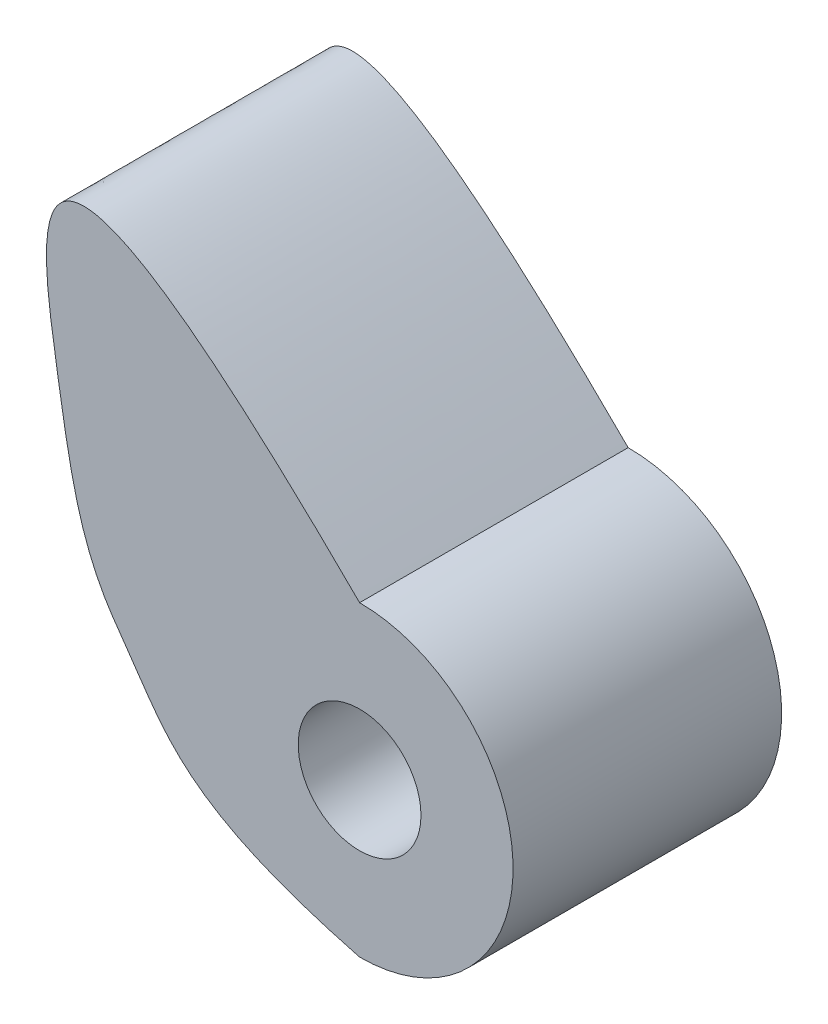
ISO-10303-21;
HEADER;
FILE_DESCRIPTION(('STEP AP214'),'2;1');
FILE_NAME('part.step','',(''),(''),'','','');
FILE_SCHEMA(('AUTOMOTIVE_DESIGN { 1 0 10303 214 1 1 1 1 }'));
ENDSEC;
DATA;
#1=APPLICATION_CONTEXT('core data for automotive mechanical design processes');
#2=APPLICATION_PROTOCOL_DEFINITION('international standard','automotive_design',2000,#1);
#3=PRODUCT_CONTEXT('',#1,'mechanical');
#4=PRODUCT('Part','Part','',(#3));
#5=PRODUCT_RELATED_PRODUCT_CATEGORY('part','',(#4));
#6=PRODUCT_DEFINITION_FORMATION('','',#4);
#7=PRODUCT_DEFINITION_CONTEXT('part definition',#1,'design');
#8=PRODUCT_DEFINITION('design','',#6,#7);
#9=PRODUCT_DEFINITION_SHAPE('','',#8);
#10=(LENGTH_UNIT() NAMED_UNIT(*) SI_UNIT(.MILLI.,.METRE.));
#11=(NAMED_UNIT(*) PLANE_ANGLE_UNIT() SI_UNIT($,.RADIAN.));
#12=(NAMED_UNIT(*) SI_UNIT($,.STERADIAN.) SOLID_ANGLE_UNIT());
#13=UNCERTAINTY_MEASURE_WITH_UNIT(LENGTH_MEASURE(1.E-05),#10,'distance_accuracy_value','');
#14=(GEOMETRIC_REPRESENTATION_CONTEXT(3) GLOBAL_UNCERTAINTY_ASSIGNED_CONTEXT((#13)) GLOBAL_UNIT_ASSIGNED_CONTEXT((#10,
#11,#12)) REPRESENTATION_CONTEXT('',''));
#15=CARTESIAN_POINT('',(0.,0.,0.));
#16=DIRECTION('',(0.,0.,1.));
#17=DIRECTION('',(1.,0.,0.));
#18=AXIS2_PLACEMENT_3D('',#15,#16,#17);
#19=CARTESIAN_POINT('',(0.,0.,-17.5));
#20=DIRECTION('',(0.,0.,1.));
#21=DIRECTION('',(1.,0.,0.));
#22=AXIS2_PLACEMENT_3D('',#19,#20,#21);
#23=CYLINDRICAL_SURFACE('',#22,10.);
#24=CARTESIAN_POINT('',(0.,0.,0.));
#25=DIRECTION('',(0.,0.,1.));
#26=DIRECTION('',(1.,0.,0.));
#27=AXIS2_PLACEMENT_3D('',#24,#25,#26);
#28=CIRCLE('',#27,10.);
#29=CARTESIAN_POINT('',(0.,-10.,0.));
#30=VERTEX_POINT('',#29);
#31=CARTESIAN_POINT('',(0.,10.,0.));
#32=VERTEX_POINT('',#31);
#33=EDGE_CURVE('E78',#30,#32,#28,.T.);
#34=ORIENTED_EDGE('',*,*,#33,.F.);
#35=DIRECTION('',(0.,0.,1.));
#36=VECTOR('',#35,1.);
#37=CARTESIAN_POINT('',(0.,-10.,-17.5));
#38=LINE('',#37,#36);
#39=CARTESIAN_POINT('',(0.,-10.,-17.5));
#40=VERTEX_POINT('',#39);
#41=EDGE_CURVE('E11',#40,#30,#38,.T.);
#42=ORIENTED_EDGE('',*,*,#41,.F.);
#43=CARTESIAN_POINT('',(0.,0.,-17.5));
#44=DIRECTION('',(0.,0.,1.));
#45=DIRECTION('',(1.,0.,0.));
#46=AXIS2_PLACEMENT_3D('',#43,#44,#45);
#47=CIRCLE('',#46,10.);
#48=CARTESIAN_POINT('',(0.,10.,-17.5));
#49=VERTEX_POINT('',#48);
#50=EDGE_CURVE('E95',#40,#49,#47,.T.);
#51=ORIENTED_EDGE('',*,*,#50,.T.);
#52=DIRECTION('',(0.,0.,1.));
#53=VECTOR('',#52,1.);
#54=CARTESIAN_POINT('',(0.,10.,-17.5));
#55=LINE('',#54,#53);
#56=EDGE_CURVE('E48',#49,#32,#55,.T.);
#57=ORIENTED_EDGE('',*,*,#56,.T.);
#58=EDGE_LOOP('',(#34,#42,#51,#57));
#59=FACE_BOUND('',#58,.T.);
#60=ADVANCED_FACE('F45',(#59),#23,.T.);
#61=CARTESIAN_POINT('',(0.,-10.,-17.5));
#62=CARTESIAN_POINT('',(-11.0712688118623,-7.11474827749795,-17.5));
#63=CARTESIAN_POINT('',(-12.811762720093,-3.28843946263851,-17.5));
#64=CARTESIAN_POINT('',(-18.1979946975012,3.93073794878136,-17.5));
#65=CARTESIAN_POINT('',(-19.7234143324466,13.1856930370888,-17.5));
#66=CARTESIAN_POINT('',(-22.7753737462315,32.7011122859322,-17.5));
#67=CARTESIAN_POINT('',(0.,9.99999999999998,-17.5));
#68=B_SPLINE_CURVE_WITH_KNOTS('',3,(#61,#62,#63,#64,#65,#66,#67),.UNSPECIFIED.,.F.,.F.,(4,1,1,1,
4),(0.,0.306432971568703,0.369658358692642,0.632253871239392,1.),.UNSPECIFIED.);
#69=DIRECTION('',(0.,0.,1.));
#70=VECTOR('',#69,1.);
#71=SURFACE_OF_LINEAR_EXTRUSION('',#68,#70);
#72=CARTESIAN_POINT('',(0.,-10.,0.));
#73=CARTESIAN_POINT('',(-11.0712688118623,-7.11474827749795,0.));
#74=CARTESIAN_POINT('',(-12.811762720093,-3.28843946263851,0.));
#75=CARTESIAN_POINT('',(-18.1979946975012,3.93073794878136,0.));
#76=CARTESIAN_POINT('',(-19.7234143324466,13.1856930370888,0.));
#77=CARTESIAN_POINT('',(-22.7753737462315,32.7011122859322,0.));
#78=CARTESIAN_POINT('',(0.,9.99999999999998,0.));
#79=B_SPLINE_CURVE_WITH_KNOTS('',3,(#72,#73,#74,#75,#76,#77,#78),.UNSPECIFIED.,.F.,.F.,(4,1,1,1,
4),(0.,0.306432971568703,0.369658358692642,0.632253871239392,1.),.UNSPECIFIED.);
#80=EDGE_CURVE('E71',#30,#32,#79,.T.);
#81=ORIENTED_EDGE('',*,*,#80,.T.);
#82=ORIENTED_EDGE('',*,*,#56,.F.);
#83=EDGE_CURVE('E73',#40,#49,#68,.T.);
#84=ORIENTED_EDGE('',*,*,#83,.F.);
#85=ORIENTED_EDGE('',*,*,#41,.T.);
#86=EDGE_LOOP('',(#81,#82,#84,#85));
#87=FACE_BOUND('',#86,.T.);
#88=ADVANCED_FACE('F70',(#87),#71,.F.);
#89=CARTESIAN_POINT('',(0.,0.,-17.5));
#90=DIRECTION('',(0.,0.,1.));
#91=DIRECTION('',(1.,0.,0.));
#92=AXIS2_PLACEMENT_3D('',#89,#90,#91);
#93=CYLINDRICAL_SURFACE('',#92,4.);
#94=CARTESIAN_POINT('',(0.,0.,-17.5));
#95=DIRECTION('',(0.,0.,1.));
#96=DIRECTION('',(1.,0.,0.));
#97=AXIS2_PLACEMENT_3D('',#94,#95,#96);
#98=CIRCLE('',#97,4.);
#99=CARTESIAN_POINT('',(4.,0.,-17.5));
#100=VERTEX_POINT('',#99);
#101=EDGE_CURVE('E85',#100,#100,#98,.T.);
#102=ORIENTED_EDGE('',*,*,#101,.F.);
#103=EDGE_LOOP('',(#102));
#104=FACE_BOUND('',#103,.T.);
#105=CARTESIAN_POINT('',(0.,0.,0.));
#106=DIRECTION('',(0.,0.,1.));
#107=DIRECTION('',(1.,0.,0.));
#108=AXIS2_PLACEMENT_3D('',#105,#106,#107);
#109=CIRCLE('',#108,4.);
#110=CARTESIAN_POINT('',(4.,0.,0.));
#111=VERTEX_POINT('',#110);
#112=EDGE_CURVE('E80',#111,#111,#109,.T.);
#113=ORIENTED_EDGE('',*,*,#112,.T.);
#114=EDGE_LOOP('',(#113));
#115=FACE_BOUND('',#114,.T.);
#116=ADVANCED_FACE('F109',(#104,#115),#93,.F.);
#117=CARTESIAN_POINT('',(0.,0.,-17.5));
#118=DIRECTION('',(0.,0.,1.));
#119=DIRECTION('',(1.,0.,0.));
#120=AXIS2_PLACEMENT_3D('',#117,#118,#119);
#121=PLANE('',#120);
#122=ORIENTED_EDGE('',*,*,#50,.F.);
#123=ORIENTED_EDGE('',*,*,#83,.T.);
#124=EDGE_LOOP('',(#122,#123));
#125=FACE_BOUND('',#124,.T.);
#126=ORIENTED_EDGE('',*,*,#101,.T.);
#127=EDGE_LOOP('',(#126));
#128=FACE_BOUND('',#127,.T.);
#129=ADVANCED_FACE('F112',(#125,#128),#121,.F.);
#130=CARTESIAN_POINT('',(0.,0.,0.));
#131=DIRECTION('',(0.,0.,1.));
#132=DIRECTION('',(1.,0.,0.));
#133=AXIS2_PLACEMENT_3D('',#130,#131,#132);
#134=PLANE('',#133);
#135=ORIENTED_EDGE('',*,*,#33,.T.);
#136=ORIENTED_EDGE('',*,*,#80,.F.);
#137=EDGE_LOOP('',(#135,#136));
#138=FACE_BOUND('',#137,.T.);
#139=ORIENTED_EDGE('',*,*,#112,.F.);
#140=EDGE_LOOP('',(#139));
#141=FACE_BOUND('',#140,.T.);
#142=ADVANCED_FACE('F76',(#138,#141),#134,.T.);
#143=CLOSED_SHELL('',(#60,#88,#116,#129,#142));
#144=MANIFOLD_SOLID_BREP('B2',#143);
#145=ADVANCED_BREP_SHAPE_REPRESENTATION('',(#18,#144),#14);
#146=SHAPE_DEFINITION_REPRESENTATION(#9,#145);
ENDSEC;
END-ISO-10303-21;
